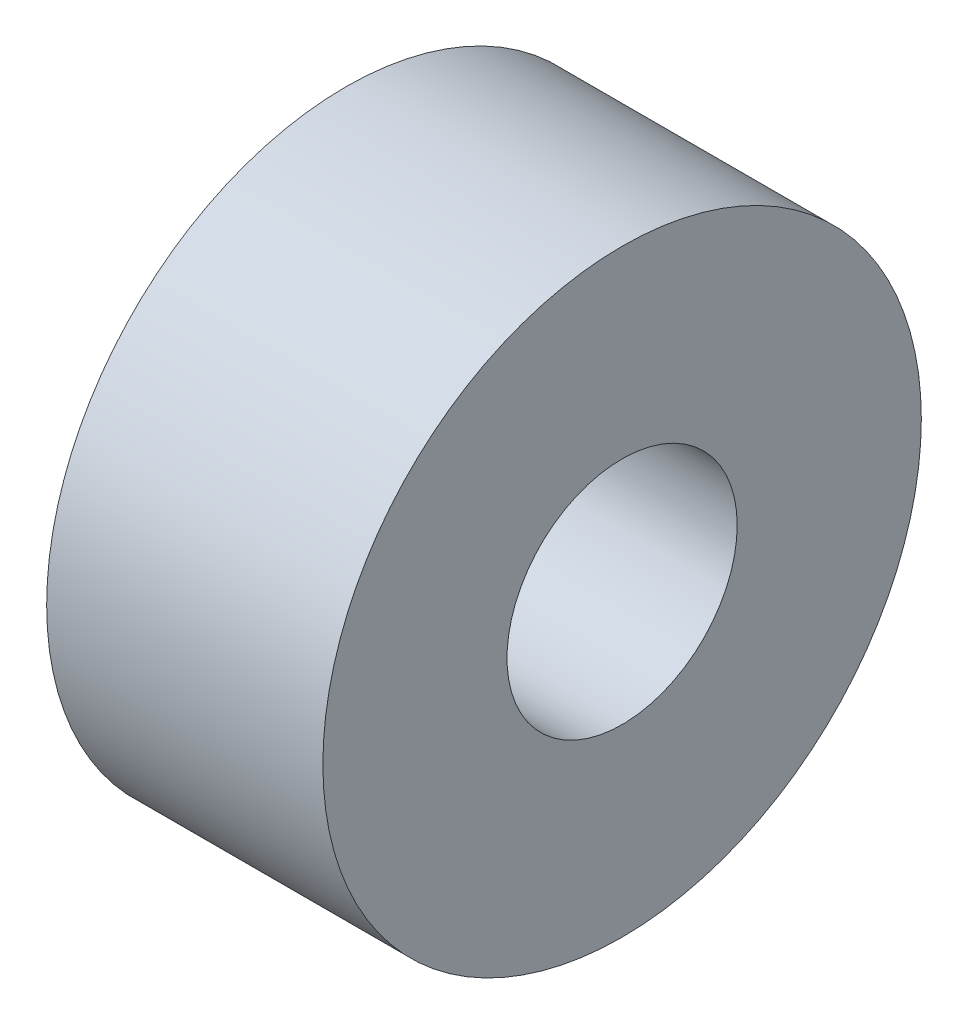
ISO-10303-21;
HEADER;
FILE_DESCRIPTION(('STEP AP214'),'2;1');
FILE_NAME('part.step','',(''),(''),'','','');
FILE_SCHEMA(('AUTOMOTIVE_DESIGN { 1 0 10303 214 1 1 1 1 }'));
ENDSEC;
DATA;
#1=APPLICATION_CONTEXT('core data for automotive mechanical design processes');
#2=APPLICATION_PROTOCOL_DEFINITION('international standard','automotive_design',2000,#1);
#3=PRODUCT_CONTEXT('',#1,'mechanical');
#4=PRODUCT('Part','Part','',(#3));
#5=PRODUCT_RELATED_PRODUCT_CATEGORY('part','',(#4));
#6=PRODUCT_DEFINITION_FORMATION('','',#4);
#7=PRODUCT_DEFINITION_CONTEXT('part definition',#1,'design');
#8=PRODUCT_DEFINITION('design','',#6,#7);
#9=PRODUCT_DEFINITION_SHAPE('','',#8);
#10=(LENGTH_UNIT() NAMED_UNIT(*) SI_UNIT(.MILLI.,.METRE.));
#11=(NAMED_UNIT(*) PLANE_ANGLE_UNIT() SI_UNIT($,.RADIAN.));
#12=(NAMED_UNIT(*) SI_UNIT($,.STERADIAN.) SOLID_ANGLE_UNIT());
#13=UNCERTAINTY_MEASURE_WITH_UNIT(LENGTH_MEASURE(1.E-05),#10,'distance_accuracy_value','');
#14=(GEOMETRIC_REPRESENTATION_CONTEXT(3) GLOBAL_UNCERTAINTY_ASSIGNED_CONTEXT((#13)) GLOBAL_UNIT_ASSIGNED_CONTEXT((#10,
#11,#12)) REPRESENTATION_CONTEXT('',''));
#15=CARTESIAN_POINT('',(0.,0.,0.));
#16=DIRECTION('',(0.,0.,1.));
#17=DIRECTION('',(1.,0.,0.));
#18=AXIS2_PLACEMENT_3D('',#15,#16,#17);
#19=CARTESIAN_POINT('',(60.,0.,0.));
#20=DIRECTION('',(1.,0.,0.));
#21=DIRECTION('',(0.,0.,-1.));
#22=AXIS2_PLACEMENT_3D('',#19,#20,#21);
#23=PLANE('',#22);
#24=CARTESIAN_POINT('',(60.,0.,0.));
#25=DIRECTION('',(1.,0.,0.));
#26=DIRECTION('',(0.,0.,-1.));
#27=AXIS2_PLACEMENT_3D('',#24,#25,#26);
#28=CIRCLE('',#27,65.);
#29=CARTESIAN_POINT('',(60.,0.,-65.));
#30=VERTEX_POINT('',#29);
#31=EDGE_CURVE('E10',#30,#30,#28,.T.);
#32=ORIENTED_EDGE('',*,*,#31,.T.);
#33=EDGE_LOOP('',(#32));
#34=FACE_BOUND('',#33,.T.);
#35=CARTESIAN_POINT('',(60.,0.,0.));
#36=DIRECTION('',(1.,0.,0.));
#37=DIRECTION('',(0.,0.,-1.));
#38=AXIS2_PLACEMENT_3D('',#35,#36,#37);
#39=CIRCLE('',#38,25.);
#40=CARTESIAN_POINT('',(60.,0.,-25.));
#41=VERTEX_POINT('',#40);
#42=EDGE_CURVE('E47',#41,#41,#39,.T.);
#43=ORIENTED_EDGE('',*,*,#42,.F.);
#44=EDGE_LOOP('',(#43));
#45=FACE_BOUND('',#44,.T.);
#46=ADVANCED_FACE('F36',(#34,#45),#23,.T.);
#47=CARTESIAN_POINT('',(0.,0.,0.));
#48=DIRECTION('',(1.,0.,0.));
#49=DIRECTION('',(0.,0.,-1.));
#50=AXIS2_PLACEMENT_3D('',#47,#48,#49);
#51=PLANE('',#50);
#52=CARTESIAN_POINT('',(0.,0.,0.));
#53=DIRECTION('',(1.,0.,0.));
#54=DIRECTION('',(0.,0.,-1.));
#55=AXIS2_PLACEMENT_3D('',#52,#53,#54);
#56=CIRCLE('',#55,65.);
#57=CARTESIAN_POINT('',(0.,0.,-65.));
#58=VERTEX_POINT('',#57);
#59=EDGE_CURVE('E40',#58,#58,#56,.T.);
#60=ORIENTED_EDGE('',*,*,#59,.F.);
#61=EDGE_LOOP('',(#60));
#62=FACE_BOUND('',#61,.T.);
#63=CARTESIAN_POINT('',(0.,0.,0.));
#64=DIRECTION('',(1.,0.,0.));
#65=DIRECTION('',(0.,0.,-1.));
#66=AXIS2_PLACEMENT_3D('',#63,#64,#65);
#67=CIRCLE('',#66,25.);
#68=CARTESIAN_POINT('',(0.,0.,-25.));
#69=VERTEX_POINT('',#68);
#70=EDGE_CURVE('E49',#69,#69,#67,.T.);
#71=ORIENTED_EDGE('',*,*,#70,.T.);
#72=EDGE_LOOP('',(#71));
#73=FACE_BOUND('',#72,.T.);
#74=ADVANCED_FACE('F59',(#62,#73),#51,.F.);
#75=CARTESIAN_POINT('',(60.,0.,0.));
#76=DIRECTION('',(-1.,0.,0.));
#77=DIRECTION('',(0.,0.,1.));
#78=AXIS2_PLACEMENT_3D('',#75,#76,#77);
#79=CYLINDRICAL_SURFACE('',#78,65.);
#80=ORIENTED_EDGE('',*,*,#31,.F.);
#81=EDGE_LOOP('',(#80));
#82=FACE_BOUND('',#81,.T.);
#83=ORIENTED_EDGE('',*,*,#59,.T.);
#84=EDGE_LOOP('',(#83));
#85=FACE_BOUND('',#84,.T.);
#86=ADVANCED_FACE('F38',(#82,#85),#79,.T.);
#87=CARTESIAN_POINT('',(60.,0.,0.));
#88=DIRECTION('',(-1.,0.,0.));
#89=DIRECTION('',(0.,0.,1.));
#90=AXIS2_PLACEMENT_3D('',#87,#88,#89);
#91=CYLINDRICAL_SURFACE('',#90,25.);
#92=ORIENTED_EDGE('',*,*,#42,.T.);
#93=EDGE_LOOP('',(#92));
#94=FACE_BOUND('',#93,.T.);
#95=ORIENTED_EDGE('',*,*,#70,.F.);
#96=EDGE_LOOP('',(#95));
#97=FACE_BOUND('',#96,.T.);
#98=ADVANCED_FACE('F55',(#94,#97),#91,.F.);
#99=CLOSED_SHELL('',(#46,#74,#86,#98));
#100=MANIFOLD_SOLID_BREP('B2',#99);
#101=ADVANCED_BREP_SHAPE_REPRESENTATION('',(#18,#100),#14);
#102=SHAPE_DEFINITION_REPRESENTATION(#9,#101);
ENDSEC;
END-ISO-10303-21;
